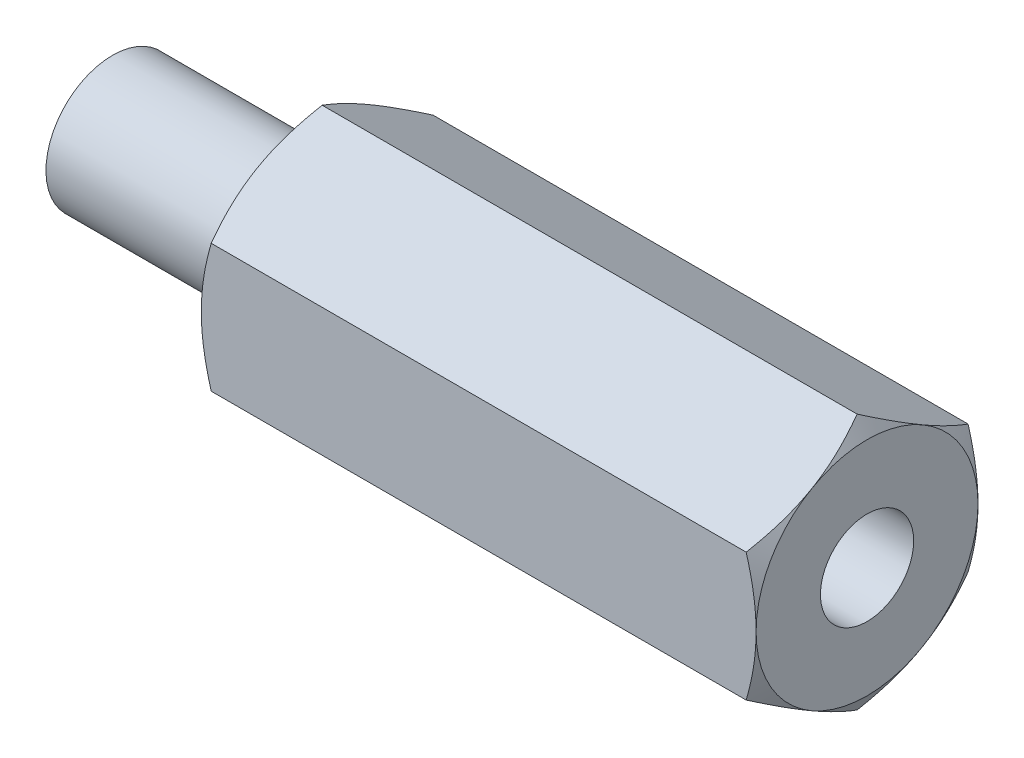
ISO-10303-21;
HEADER;
FILE_DESCRIPTION(('STEP AP214'),'2;1');
FILE_NAME('part.step','',(''),(''),'','','');
FILE_SCHEMA(('AUTOMOTIVE_DESIGN { 1 0 10303 214 1 1 1 1 }'));
ENDSEC;
DATA;
#1=APPLICATION_CONTEXT('core data for automotive mechanical design processes');
#2=APPLICATION_PROTOCOL_DEFINITION('international standard','automotive_design',2000,#1);
#3=PRODUCT_CONTEXT('',#1,'mechanical');
#4=PRODUCT('Part','Part','',(#3));
#5=PRODUCT_RELATED_PRODUCT_CATEGORY('part','',(#4));
#6=PRODUCT_DEFINITION_FORMATION('','',#4);
#7=PRODUCT_DEFINITION_CONTEXT('part definition',#1,'design');
#8=PRODUCT_DEFINITION('design','',#6,#7);
#9=PRODUCT_DEFINITION_SHAPE('','',#8);
#10=(LENGTH_UNIT() NAMED_UNIT(*) SI_UNIT(.MILLI.,.METRE.));
#11=(NAMED_UNIT(*) PLANE_ANGLE_UNIT() SI_UNIT($,.RADIAN.));
#12=(NAMED_UNIT(*) SI_UNIT($,.STERADIAN.) SOLID_ANGLE_UNIT());
#13=UNCERTAINTY_MEASURE_WITH_UNIT(LENGTH_MEASURE(1.E-05),#10,'distance_accuracy_value','');
#14=(GEOMETRIC_REPRESENTATION_CONTEXT(3) GLOBAL_UNCERTAINTY_ASSIGNED_CONTEXT((#13)) GLOBAL_UNIT_ASSIGNED_CONTEXT((#10,
#11,#12)) REPRESENTATION_CONTEXT('',''));
#15=CARTESIAN_POINT('',(0.,0.,0.));
#16=DIRECTION('',(0.,0.,1.));
#17=DIRECTION('',(1.,0.,0.));
#18=AXIS2_PLACEMENT_3D('',#15,#16,#17);
#19=CARTESIAN_POINT('',(25.,2.88675134594813,-5.));
#20=DIRECTION('',(0.,-0.866025403784439,0.5));
#21=DIRECTION('',(0.,-0.5,-0.866025403784439));
#22=AXIS2_PLACEMENT_3D('',#19,#20,#21);
#23=PLANE('',#22);
#24=CARTESIAN_POINT('',(24.5533513439482,2.88663587589429,-5.0002));
#25=CARTESIAN_POINT('',(24.6266134323624,3.01349970319368,-4.78046540547482));
#26=CARTESIAN_POINT('',(24.6932486780819,3.14144859993849,-4.55885141554042));
#27=CARTESIAN_POINT('',(24.8095610089892,3.39956193532121,-4.11178600454649));
#28=CARTESIAN_POINT('',(24.8591969500842,3.52973095989718,-3.88632664040923));
#29=CARTESIAN_POINT('',(24.9364489745813,3.78847564779797,-3.43816769477649));
#30=CARTESIAN_POINT('',(24.9645796217165,3.91701101576052,-3.21553790689581));
#31=CARTESIAN_POINT('',(24.9898050780463,4.11026620624322,-2.88081009815336));
#32=CARTESIAN_POINT('',(24.9953865402305,4.1747286887931,-2.76915780319494));
#33=CARTESIAN_POINT('',(25.0007977832485,4.30371322717527,-2.54575002932621));
#34=CARTESIAN_POINT('',(25.0006277417418,4.36823528110588,-2.43399455370969));
#35=CARTESIAN_POINT('',(24.992246368208,4.54500768479194,-2.12781576914936));
#36=CARTESIAN_POINT('',(24.9781702281028,4.65719946015292,-1.93349391403279));
#37=CARTESIAN_POINT('',(24.9335347428906,4.88083840557981,-1.5461398980023));
#38=CARTESIAN_POINT('',(24.9029601398525,4.9922847895602,-1.35310909862843));
#39=CARTESIAN_POINT('',(24.8265315063788,5.21637431361295,-0.964974657525146));
#40=CARTESIAN_POINT('',(24.7803536211213,5.32898917185759,-0.769920001358265));
#41=CARTESIAN_POINT('',(24.6755482055081,5.55253939626498,-0.382719654641231));
#42=CARTESIAN_POINT('',(24.6169452965626,5.66347762579592,-0.190569004591912));
#43=CARTESIAN_POINT('',(24.5533513439482,5.7736181619501,0.000200000000001614));
#44=B_SPLINE_CURVE_WITH_KNOTS('',3,(#24,#25,#26,#27,#28,#29,#30,#31,#32,#33,#34,#35,#36,#37,#38,
#39,#40,#41,#42,#43),.UNSPECIFIED.,.F.,.F.,(4,2,2,2,2,2,2,2,2,4),(0.,0.79255584136309,
1.58701660053333,2.3618153748728,2.74884076077325,3.13585419177294,3.80962362599679,
4.48401723901189,5.17336882348928,5.86136694793725),.UNSPECIFIED.);
#45=CARTESIAN_POINT('',(24.5534180126148,2.88675134594813,-5.));
#46=VERTEX_POINT('',#45);
#47=CARTESIAN_POINT('',(25.,4.3301270189222,-2.5));
#48=VERTEX_POINT('',#47);
#49=EDGE_CURVE('E292',#46,#48,#44,.T.);
#50=ORIENTED_EDGE('',*,*,#49,.F.);
#51=DIRECTION('',(-1.,0.,0.));
#52=VECTOR('',#51,1.);
#53=CARTESIAN_POINT('',(25.,2.88675134594813,-5.));
#54=LINE('',#53,#52);
#55=CARTESIAN_POINT('',(0.446581987385197,2.88675134594812,-5.));
#56=VERTEX_POINT('',#55);
#57=EDGE_CURVE('E244',#46,#56,#54,.T.);
#58=ORIENTED_EDGE('',*,*,#57,.T.);
#59=CARTESIAN_POINT('',(0.446648656051824,5.7736181619501,0.000200000000001349));
#60=CARTESIAN_POINT('',(0.373386567637631,5.64675433465071,-0.219534594525183));
#61=CARTESIAN_POINT('',(0.306751321918089,5.5188054379059,-0.441148584459578));
#62=CARTESIAN_POINT('',(0.190438991010809,5.26069210252318,-0.888213995453511));
#63=CARTESIAN_POINT('',(0.140803049915787,5.13052307794721,-1.11367335959077));
#64=CARTESIAN_POINT('',(0.0635510254186968,4.87177839004641,-1.56183230522351));
#65=CARTESIAN_POINT('',(0.0354203782834885,4.74324302208387,-1.78446209310419));
#66=CARTESIAN_POINT('',(0.0101949219536841,4.54998783160116,-2.11918990184664));
#67=CARTESIAN_POINT('',(0.00461345976948367,4.48552534905128,-2.23084219680506));
#68=CARTESIAN_POINT('',(-0.000797783248529871,4.35654081066911,-2.45424997067379));
#69=CARTESIAN_POINT('',(-0.000627741741796655,4.2920187567385,-2.56600544629031));
#70=CARTESIAN_POINT('',(0.00775363179203651,4.11524635305244,-2.87218423085063));
#71=CARTESIAN_POINT('',(0.0218297718972515,4.00305457769146,-3.06650608596721));
#72=CARTESIAN_POINT('',(0.0664652571094302,3.77941563226458,-3.4538601019977));
#73=CARTESIAN_POINT('',(0.0970398601475069,3.66796924828419,-3.64689090137157));
#74=CARTESIAN_POINT('',(0.173468493621162,3.44387972423144,-4.03502534247485));
#75=CARTESIAN_POINT('',(0.219646378878678,3.3312648659868,-4.23007999864173));
#76=CARTESIAN_POINT('',(0.324451794491931,3.10771464157941,-4.61728034535877));
#77=CARTESIAN_POINT('',(0.383054703437371,2.99677641204847,-4.80943099540809));
#78=CARTESIAN_POINT('',(0.446648656051824,2.88663587589429,-5.0002));
#79=B_SPLINE_CURVE_WITH_KNOTS('',3,(#59,#60,#61,#62,#63,#64,#65,#66,#67,#68,#69,#70,#71,#72,#73,
#74,#75,#76,#77,#78),.UNSPECIFIED.,.F.,.F.,(4,2,2,2,2,2,2,2,2,4),(0.,0.792555841363089,
1.58701660053333,2.3618153748728,2.74884076077325,3.13585419177294,3.80962362599679,
4.48401723901189,5.17336882348928,5.86136694793725),.UNSPECIFIED.);
#80=CARTESIAN_POINT('',(0.,4.33012701892219,-2.5));
#81=VERTEX_POINT('',#80);
#82=EDGE_CURVE('E301',#81,#56,#79,.T.);
#83=ORIENTED_EDGE('',*,*,#82,.F.);
#84=CARTESIAN_POINT('',(0.446581987385197,5.77350269189626,0.));
#85=VERTEX_POINT('',#84);
#86=EDGE_CURVE('E62',#85,#81,#79,.T.);
#87=ORIENTED_EDGE('',*,*,#86,.F.);
#88=DIRECTION('',(-1.,0.,0.));
#89=VECTOR('',#88,1.);
#90=CARTESIAN_POINT('',(25.,5.77350269189626,0.));
#91=LINE('',#90,#89);
#92=CARTESIAN_POINT('',(24.5534180126148,5.77350269189626,0.));
#93=VERTEX_POINT('',#92);
#94=EDGE_CURVE('E254',#93,#85,#91,.T.);
#95=ORIENTED_EDGE('',*,*,#94,.F.);
#96=EDGE_CURVE('E210',#48,#93,#44,.T.);
#97=ORIENTED_EDGE('',*,*,#96,.F.);
#98=EDGE_LOOP('',(#50,#58,#83,#87,#95,#97));
#99=FACE_BOUND('',#98,.T.);
#100=ADVANCED_FACE('F39',(#99),#23,.F.);
#101=CARTESIAN_POINT('',(25.,5.77350269189626,0.));
#102=DIRECTION('',(0.,-0.866025403784439,-0.5));
#103=DIRECTION('',(0.,0.5,-0.866025403784439));
#104=AXIS2_PLACEMENT_3D('',#101,#102,#103);
#105=PLANE('',#104);
#106=CARTESIAN_POINT('',(24.5533513439482,5.7736181619501,-0.000199999999998705));
#107=CARTESIAN_POINT('',(24.6266134323624,5.64675433465071,0.219534594525186));
#108=CARTESIAN_POINT('',(24.6932486780819,5.5188054379059,0.441148584459581));
#109=CARTESIAN_POINT('',(24.8095610089892,5.26069210252318,0.888213995453513));
#110=CARTESIAN_POINT('',(24.8591969500842,5.13052307794721,1.11367335959077));
#111=CARTESIAN_POINT('',(24.9364489745813,4.87177839004641,1.56183230522351));
#112=CARTESIAN_POINT('',(24.9645796217165,4.74324302208387,1.78446209310419));
#113=CARTESIAN_POINT('',(24.9898050780463,4.54998783160116,2.11918990184664));
#114=CARTESIAN_POINT('',(24.9953865402305,4.48552534905128,2.23084219680506));
#115=CARTESIAN_POINT('',(25.0007977832485,4.35654081066911,2.4542499706738));
#116=CARTESIAN_POINT('',(25.0006277417418,4.2920187567385,2.56600544629031));
#117=CARTESIAN_POINT('',(24.992246368208,4.11524635305244,2.87218423085064));
#118=CARTESIAN_POINT('',(24.9781702281027,4.00305457769146,3.06650608596721));
#119=CARTESIAN_POINT('',(24.9335347428906,3.77941563226458,3.45386010199771));
#120=CARTESIAN_POINT('',(24.9029601398525,3.66796924828419,3.64689090137157));
#121=CARTESIAN_POINT('',(24.8265315063788,3.44387972423144,4.03502534247485));
#122=CARTESIAN_POINT('',(24.7803536211213,3.3312648659868,4.23007999864174));
#123=CARTESIAN_POINT('',(24.6755482055081,3.10771464157941,4.61728034535877));
#124=CARTESIAN_POINT('',(24.6169452965626,2.99677641204847,4.80943099540809));
#125=CARTESIAN_POINT('',(24.5533513439482,2.88663587589429,5.0002));
#126=B_SPLINE_CURVE_WITH_KNOTS('',3,(#106,#107,#108,#109,#110,#111,#112,#113,#114,#115,#116,
#117,#118,#119,#120,#121,#122,#123,#124,#125),.UNSPECIFIED.,.F.,.F.,(4,2,2,2,2,2,2,2,2,4),(0.,
0.792555841363089,1.58701660053333,2.3618153748728,2.74884076077325,3.13585419177295,
3.80962362599679,4.48401723901189,5.17336882348928,5.86136694793725),.UNSPECIFIED.);
#127=CARTESIAN_POINT('',(25.,4.3301270189222,2.5));
#128=VERTEX_POINT('',#127);
#129=EDGE_CURVE('E208',#93,#128,#126,.T.);
#130=ORIENTED_EDGE('',*,*,#129,.F.);
#131=ORIENTED_EDGE('',*,*,#94,.T.);
#132=CARTESIAN_POINT('',(0.446648656051825,2.88663587589429,5.0002));
#133=CARTESIAN_POINT('',(0.373386567637632,3.01349970319368,4.78046540547482));
#134=CARTESIAN_POINT('',(0.30675132191809,3.14144859993849,4.55885141554042));
#135=CARTESIAN_POINT('',(0.19043899101081,3.39956193532121,4.11178600454649));
#136=CARTESIAN_POINT('',(0.140803049915788,3.52973095989718,3.88632664040923));
#137=CARTESIAN_POINT('',(0.0635510254186981,3.78847564779798,3.43816769477649));
#138=CARTESIAN_POINT('',(0.0354203782834897,3.91701101576052,3.21553790689581));
#139=CARTESIAN_POINT('',(0.0101949219536848,4.11026620624322,2.88081009815336));
#140=CARTESIAN_POINT('',(0.00461345976948421,4.17472868879311,2.76915780319494));
#141=CARTESIAN_POINT('',(-0.000797783248529407,4.30371322717528,2.5457500293262));
#142=CARTESIAN_POINT('',(-0.000627741741796067,4.36823528110589,2.43399455370969));
#143=CARTESIAN_POINT('',(0.00775363179203718,4.54500768479194,2.12781576914936));
#144=CARTESIAN_POINT('',(0.0218297718972518,4.65719946015292,1.93349391403279));
#145=CARTESIAN_POINT('',(0.0664652571094305,4.88083840557981,1.5461398980023));
#146=CARTESIAN_POINT('',(0.0970398601475074,4.9922847895602,1.35310909862843));
#147=CARTESIAN_POINT('',(0.173468493621162,5.21637431361295,0.964974657525148));
#148=CARTESIAN_POINT('',(0.219646378878678,5.32898917185759,0.769920001358267));
#149=CARTESIAN_POINT('',(0.324451794491931,5.55253939626498,0.382719654641233));
#150=CARTESIAN_POINT('',(0.38305470343737,5.66347762579592,0.190569004591914));
#151=CARTESIAN_POINT('',(0.446648656051824,5.7736181619501,-0.000199999999999497));
#152=B_SPLINE_CURVE_WITH_KNOTS('',3,(#132,#133,#134,#135,#136,#137,#138,#139,#140,#141,#142,
#143,#144,#145,#146,#147,#148,#149,#150,#151),.UNSPECIFIED.,.F.,.F.,(4,2,2,2,2,2,2,2,2,4),(0.,
0.79255584136309,1.58701660053333,2.3618153748728,2.74884076077325,3.13585419177295,
3.80962362599679,4.48401723901189,5.17336882348928,5.86136694793725),.UNSPECIFIED.);
#153=CARTESIAN_POINT('',(0.,4.33012701892219,2.5));
#154=VERTEX_POINT('',#153);
#155=EDGE_CURVE('E224',#154,#85,#152,.T.);
#156=ORIENTED_EDGE('',*,*,#155,.F.);
#157=CARTESIAN_POINT('',(0.446581987385197,2.88675134594812,5.));
#158=VERTEX_POINT('',#157);
#159=EDGE_CURVE('E230',#158,#154,#152,.T.);
#160=ORIENTED_EDGE('',*,*,#159,.F.);
#161=DIRECTION('',(-1.,0.,0.));
#162=VECTOR('',#161,1.);
#163=CARTESIAN_POINT('',(25.,2.88675134594813,5.));
#164=LINE('',#163,#162);
#165=CARTESIAN_POINT('',(24.5534180126148,2.88675134594813,5.));
#166=VERTEX_POINT('',#165);
#167=EDGE_CURVE('E252',#166,#158,#164,.T.);
#168=ORIENTED_EDGE('',*,*,#167,.F.);
#169=EDGE_CURVE('E203',#128,#166,#126,.T.);
#170=ORIENTED_EDGE('',*,*,#169,.F.);
#171=EDGE_LOOP('',(#130,#131,#156,#160,#168,#170));
#172=FACE_BOUND('',#171,.T.);
#173=ADVANCED_FACE('F215',(#172),#105,.F.);
#174=CARTESIAN_POINT('',(25.,2.88675134594813,5.));
#175=DIRECTION('',(0.,0.,-1.));
#176=DIRECTION('',(0.,1.,0.));
#177=AXIS2_PLACEMENT_3D('',#174,#175,#176);
#178=PLANE('',#177);
#179=CARTESIAN_POINT('',(22.6073664734492,-7.65608998744865,5.));
#180=CARTESIAN_POINT('',(22.713454661828,-7.43656171400166,5.));
#181=CARTESIAN_POINT('',(22.8184882453841,-7.21651440170021,5.));
#182=CARTESIAN_POINT('',(23.0258435663603,-6.77510105921518,5.));
#183=CARTESIAN_POINT('',(23.1281648342544,-6.55373480873052,5.));
#184=CARTESIAN_POINT('',(23.3300319214651,-6.10820714710356,5.));
#185=CARTESIAN_POINT('',(23.4295585071827,-5.88403698971124,5.));
#186=CARTESIAN_POINT('',(23.6243367672132,-5.43385418074676,5.));
#187=CARTESIAN_POINT('',(23.7195886643576,-5.20784162594277,5.));
#188=CARTESIAN_POINT('',(23.9058116908106,-4.75080884782755,5.));
#189=CARTESIAN_POINT('',(23.9967159090013,-4.51976121099504,5.));
#190=CARTESIAN_POINT('',(24.1714046970281,-4.05494053422099,5.));
#191=CARTESIAN_POINT('',(24.2551884747524,-3.82116719434024,5.));
#192=CARTESIAN_POINT('',(24.4133853676354,-3.35100416711889,5.));
#193=CARTESIAN_POINT('',(24.4878184047747,-3.11462125088187,5.));
#194=CARTESIAN_POINT('',(24.6248956061276,-2.63849247870023,5.));
#195=CARTESIAN_POINT('',(24.6875434984031,-2.3987477121033,5.));
#196=CARTESIAN_POINT('',(24.7980122460051,-1.91574303714497,5.));
#197=CARTESIAN_POINT('',(24.8458291534414,-1.672482210841,5.));
#198=CARTESIAN_POINT('',(24.9234044442076,-1.18299359688664,5.));
#199=CARTESIAN_POINT('',(24.9531628115716,-0.936765806613281,5.));
#200=CARTESIAN_POINT('',(24.9823487984137,-0.567032279323849,5.));
#201=CARTESIAN_POINT('',(24.9895036809401,-0.444105297658541,5.));
#202=CARTESIAN_POINT('',(24.998604547731,-0.198053005238567,5.));
#203=CARTESIAN_POINT('',(25.0005505996396,-0.0749276970802314,5.));
#204=CARTESIAN_POINT('',(24.9991815296543,0.17125799989235,5.));
#205=CARTESIAN_POINT('',(24.995867885687,0.294318397227084,5.));
#206=CARTESIAN_POINT('',(24.9840634027172,0.540192730788837,5.));
#207=CARTESIAN_POINT('',(24.9755723024298,0.66300665426348,5.));
#208=CARTESIAN_POINT('',(24.9488936197247,0.960681872881667,5.));
#209=CARTESIAN_POINT('',(24.9281110323017,1.1353143627994,5.));
#210=CARTESIAN_POINT('',(24.8772343442773,1.4832167579939,5.));
#211=CARTESIAN_POINT('',(24.84713900201,1.65648647841238,5.));
#212=CARTESIAN_POINT('',(24.7787012079885,2.00155426058701,5.));
#213=CARTESIAN_POINT('',(24.7403505225136,2.17335067370376,5.));
#214=CARTESIAN_POINT('',(24.656571694615,2.51518168221057,5.));
#215=CARTESIAN_POINT('',(24.611143983086,2.68521638419314,5.));
#216=CARTESIAN_POINT('',(24.5131122179457,3.02770318928896,5.));
#217=CARTESIAN_POINT('',(24.4603596361761,3.20011248435316,5.));
#218=CARTESIAN_POINT('',(24.3496422126974,3.54310870430182,5.));
#219=CARTESIAN_POINT('',(24.2916809660929,3.7136967965972,5.));
#220=CARTESIAN_POINT('',(24.1717434592715,4.0523661026798,5.));
#221=CARTESIAN_POINT('',(24.1097916345736,4.22045602230063,5.));
#222=CARTESIAN_POINT('',(23.9822517658619,4.55533171687456,5.));
#223=CARTESIAN_POINT('',(23.9166622522122,4.72211693321423,5.));
#224=CARTESIAN_POINT('',(23.8496137418227,4.88829623733364,5.));
#225=B_SPLINE_CURVE_WITH_KNOTS('',3,(#179,#180,#181,#182,#183,#184,#185,#186,#187,#188,#189,
#190,#191,#192,#193,#194,#195,#196,#197,#198,#199,#200,#201,#202,#203,#204,#205,#206,#207,#208,
#209,#210,#211,#212,#213,#214,#215,#216,#217,#218,#219,#220,#221,#222,#223,#224),.UNSPECIFIED.,
.F.,.F.,(4,2,2,2,2,2,2,2,2,2,2,2,2,2,2,2,2,2,2,2,2,2,4),(0.,0.731464740665349,1.46305528824908,
2.19883243307486,2.93457117856033,3.67934251246857,4.4241965901336,5.16743580871988,
5.91043951739337,6.65364083834805,7.39684281638514,7.76615414335454,8.13546067426608,
8.50466345177854,8.8738848629845,9.40118542949726,9.92855633110015,10.4564556797854,
10.9843228991235,11.525120280828,12.0655472210641,12.6029322754131,13.1405360390026),.UNSPECIFIED.);
#226=CARTESIAN_POINT('',(25.,0.,5.));
#227=VERTEX_POINT('',#226);
#228=EDGE_CURVE('E209',#166,#227,#225,.F.);
#229=ORIENTED_EDGE('',*,*,#228,.F.);
#230=ORIENTED_EDGE('',*,*,#167,.T.);
#231=CARTESIAN_POINT('',(2.39263352655076,-7.65608998744865,5.));
#232=CARTESIAN_POINT('',(2.28654533817203,-7.43656171400166,5.));
#233=CARTESIAN_POINT('',(2.18151175461592,-7.21651440170021,5.));
#234=CARTESIAN_POINT('',(1.97415643363973,-6.77510105921518,5.));
#235=CARTESIAN_POINT('',(1.87183516574565,-6.55373480873052,5.));
#236=CARTESIAN_POINT('',(1.66996807853488,-6.10820714710356,5.));
#237=CARTESIAN_POINT('',(1.57044149281728,-5.88403698971124,5.));
#238=CARTESIAN_POINT('',(1.37566323278679,-5.43385418074676,5.));
#239=CARTESIAN_POINT('',(1.28041133564241,-5.20784162594277,5.));
#240=CARTESIAN_POINT('',(1.09418830918939,-4.75080884782755,5.));
#241=CARTESIAN_POINT('',(1.00328409099868,-4.51976121099505,5.));
#242=CARTESIAN_POINT('',(0.828595302971934,-4.05494053422099,5.));
#243=CARTESIAN_POINT('',(0.744811525247638,-3.82116719434024,5.));
#244=CARTESIAN_POINT('',(0.586614632364609,-3.35100416711889,5.));
#245=CARTESIAN_POINT('',(0.512181595225262,-3.11462125088187,5.));
#246=CARTESIAN_POINT('',(0.375104393872371,-2.63849247870023,5.));
#247=CARTESIAN_POINT('',(0.312456501596944,-2.3987477121033,5.));
#248=CARTESIAN_POINT('',(0.201987753994866,-1.91574303714497,5.));
#249=CARTESIAN_POINT('',(0.15417084655864,-1.672482210841,5.));
#250=CARTESIAN_POINT('',(0.0765955557924016,-1.18299359688664,5.));
#251=CARTESIAN_POINT('',(0.0468371884284089,-0.936765806613282,5.));
#252=CARTESIAN_POINT('',(0.0176512015862967,-0.567032279323849,5.));
#253=CARTESIAN_POINT('',(0.0104963190599473,-0.444105297658542,5.));
#254=CARTESIAN_POINT('',(0.00139545226904139,-0.198053005238568,5.));
#255=CARTESIAN_POINT('',(-0.000550599639613759,-0.0749276970802312,5.));
#256=CARTESIAN_POINT('',(0.000818470345664651,0.171257999892351,5.));
#257=CARTESIAN_POINT('',(0.00413211431301193,0.294318397227086,5.));
#258=CARTESIAN_POINT('',(0.01593659728276,0.540192730788838,5.));
#259=CARTESIAN_POINT('',(0.024427697570165,0.663006654263481,5.));
#260=CARTESIAN_POINT('',(0.0511063802753007,0.960681872881667,5.));
#261=CARTESIAN_POINT('',(0.0718889676982861,1.1353143627994,5.));
#262=CARTESIAN_POINT('',(0.122765655722695,1.4832167579939,5.));
#263=CARTESIAN_POINT('',(0.152860997990035,1.65648647841238,5.));
#264=CARTESIAN_POINT('',(0.221298792011553,2.00155426058701,5.));
#265=CARTESIAN_POINT('',(0.259649477486407,2.17335067370376,5.));
#266=CARTESIAN_POINT('',(0.343428305385015,2.51518168221057,5.));
#267=CARTESIAN_POINT('',(0.388856016914006,2.68521638419314,5.));
#268=CARTESIAN_POINT('',(0.486887782054298,3.02770318928896,5.));
#269=CARTESIAN_POINT('',(0.539640363823949,3.20011248435316,5.));
#270=CARTESIAN_POINT('',(0.650357787302634,3.54310870430182,5.));
#271=CARTESIAN_POINT('',(0.708319033907079,3.7136967965972,5.));
#272=CARTESIAN_POINT('',(0.828256540728484,4.0523661026798,5.));
#273=CARTESIAN_POINT('',(0.890208365426376,4.22045602230063,5.));
#274=CARTESIAN_POINT('',(1.01774823413813,4.55533171687456,5.));
#275=CARTESIAN_POINT('',(1.08333774778779,4.72211693321422,5.));
#276=CARTESIAN_POINT('',(1.15038625817726,4.88829623733364,5.));
#277=B_SPLINE_CURVE_WITH_KNOTS('',3,(#231,#232,#233,#234,#235,#236,#237,#238,#239,#240,#241,
#242,#243,#244,#245,#246,#247,#248,#249,#250,#251,#252,#253,#254,#255,#256,#257,#258,#259,#260,
#261,#262,#263,#264,#265,#266,#267,#268,#269,#270,#271,#272,#273,#274,#275,#276),.UNSPECIFIED.,
.F.,.F.,(4,2,2,2,2,2,2,2,2,2,2,2,2,2,2,2,2,2,2,2,2,2,4),(0.,0.731464740665351,1.46305528824908,
2.19883243307485,2.93457117856033,3.67934251246857,4.4241965901336,5.16743580871988,
5.91043951739337,6.65364083834805,7.39684281638514,7.76615414335454,8.13546067426608,
8.50466345177854,8.87388486298451,9.40118542949726,9.92855633110015,10.4564556797854,
10.9843228991235,11.525120280828,12.0655472210641,12.6029322754131,13.1405360390026),.UNSPECIFIED.);
#278=CARTESIAN_POINT('',(0.,0.,5.));
#279=VERTEX_POINT('',#278);
#280=EDGE_CURVE('E236',#279,#158,#277,.T.);
#281=ORIENTED_EDGE('',*,*,#280,.F.);
#282=CARTESIAN_POINT('',(0.446581987385197,-2.88675134594813,5.));
#283=VERTEX_POINT('',#282);
#284=EDGE_CURVE('E242',#283,#279,#277,.T.);
#285=ORIENTED_EDGE('',*,*,#284,.F.);
#286=DIRECTION('',(-1.,0.,0.));
#287=VECTOR('',#286,1.);
#288=CARTESIAN_POINT('',(25.,-2.88675134594813,5.));
#289=LINE('',#288,#287);
#290=CARTESIAN_POINT('',(24.5534180126148,-2.88675134594813,5.));
#291=VERTEX_POINT('',#290);
#292=EDGE_CURVE('E250',#291,#283,#289,.T.);
#293=ORIENTED_EDGE('',*,*,#292,.F.);
#294=EDGE_CURVE('E197',#227,#291,#225,.F.);
#295=ORIENTED_EDGE('',*,*,#294,.F.);
#296=EDGE_LOOP('',(#229,#230,#281,#285,#293,#295));
#297=FACE_BOUND('',#296,.T.);
#298=ADVANCED_FACE('F218',(#297),#178,.F.);
#299=CARTESIAN_POINT('',(25.,-2.88675134594813,5.));
#300=DIRECTION('',(0.,0.866025403784439,-0.5));
#301=DIRECTION('',(0.,0.5,0.866025403784439));
#302=AXIS2_PLACEMENT_3D('',#299,#300,#301);
#303=PLANE('',#302);
#304=CARTESIAN_POINT('',(24.5533513439482,-2.88663587589429,5.0002));
#305=CARTESIAN_POINT('',(24.6266134323624,-3.01349970319368,4.78046540547481));
#306=CARTESIAN_POINT('',(24.6932486780819,-3.14144859993849,4.55885141554042));
#307=CARTESIAN_POINT('',(24.8095610089892,-3.39956193532121,4.11178600454649));
#308=CARTESIAN_POINT('',(24.8591969500842,-3.52973095989718,3.88632664040923));
#309=CARTESIAN_POINT('',(24.9364489745813,-3.78847564779798,3.43816769477649));
#310=CARTESIAN_POINT('',(24.9645796217165,-3.91701101576052,3.21553790689581));
#311=CARTESIAN_POINT('',(24.9898050780463,-4.11026620624323,2.88081009815336));
#312=CARTESIAN_POINT('',(24.9953865402305,-4.17472868879311,2.76915780319494));
#313=CARTESIAN_POINT('',(25.0007977832485,-4.30371322717528,2.5457500293262));
#314=CARTESIAN_POINT('',(25.0006277417418,-4.36823528110589,2.43399455370969));
#315=CARTESIAN_POINT('',(24.992246368208,-4.54500768479194,2.12781576914936));
#316=CARTESIAN_POINT('',(24.9781702281028,-4.65719946015292,1.93349391403279));
#317=CARTESIAN_POINT('',(24.9335347428906,-4.88083840557981,1.5461398980023));
#318=CARTESIAN_POINT('',(24.9029601398525,-4.9922847895602,1.35310909862843));
#319=CARTESIAN_POINT('',(24.8265315063788,-5.21637431361295,0.964974657525147));
#320=CARTESIAN_POINT('',(24.7803536211213,-5.32898917185759,0.769920001358266));
#321=CARTESIAN_POINT('',(24.6755482055081,-5.55253939626498,0.382719654641234));
#322=CARTESIAN_POINT('',(24.6169452965626,-5.66347762579592,0.190569004591916));
#323=CARTESIAN_POINT('',(24.5533513439482,-5.7736181619501,-0.000199999999998652));
#324=B_SPLINE_CURVE_WITH_KNOTS('',3,(#304,#305,#306,#307,#308,#309,#310,#311,#312,#313,#314,
#315,#316,#317,#318,#319,#320,#321,#322,#323),.UNSPECIFIED.,.F.,.F.,(4,2,2,2,2,2,2,2,2,4),(0.,
0.792555841363089,1.58701660053333,2.3618153748728,2.74884076077325,3.13585419177295,
3.80962362599679,4.48401723901189,5.17336882348928,5.86136694793725),.UNSPECIFIED.);
#325=CARTESIAN_POINT('',(25.,-4.3301270189222,2.5));
#326=VERTEX_POINT('',#325);
#327=EDGE_CURVE('E554',#291,#326,#324,.T.);
#328=ORIENTED_EDGE('',*,*,#327,.F.);
#329=ORIENTED_EDGE('',*,*,#292,.T.);
#330=CARTESIAN_POINT('',(0.446648656051824,-5.7736181619501,-0.000199999999999135));
#331=CARTESIAN_POINT('',(0.373386567637632,-5.64675433465071,0.219534594525186));
#332=CARTESIAN_POINT('',(0.30675132191809,-5.5188054379059,0.441148584459581));
#333=CARTESIAN_POINT('',(0.190438991010809,-5.26069210252318,0.888213995453514));
#334=CARTESIAN_POINT('',(0.140803049915788,-5.13052307794721,1.11367335959077));
#335=CARTESIAN_POINT('',(0.0635510254186977,-4.87177839004641,1.56183230522351));
#336=CARTESIAN_POINT('',(0.0354203782834896,-4.74324302208387,1.78446209310419));
#337=CARTESIAN_POINT('',(0.0101949219536848,-4.54998783160116,2.11918990184664));
#338=CARTESIAN_POINT('',(0.00461345976948422,-4.48552534905128,2.23084219680506));
#339=CARTESIAN_POINT('',(-0.000797783248529419,-4.35654081066911,2.4542499706738));
#340=CARTESIAN_POINT('',(-0.000627741741796081,-4.2920187567385,2.56600544629031));
#341=CARTESIAN_POINT('',(0.00775363179203722,-4.11524635305244,2.87218423085064));
#342=CARTESIAN_POINT('',(0.021829771897252,-4.00305457769146,3.06650608596721));
#343=CARTESIAN_POINT('',(0.0664652571094308,-3.77941563226458,3.4538601019977));
#344=CARTESIAN_POINT('',(0.0970398601475078,-3.66796924828419,3.64689090137157));
#345=CARTESIAN_POINT('',(0.173468493621163,-3.44387972423144,4.03502534247485));
#346=CARTESIAN_POINT('',(0.219646378878679,-3.3312648659868,4.23007999864174));
#347=CARTESIAN_POINT('',(0.324451794491932,-3.10771464157941,4.61728034535877));
#348=CARTESIAN_POINT('',(0.383054703437371,-2.99677641204847,4.80943099540809));
#349=CARTESIAN_POINT('',(0.446648656051825,-2.88663587589429,5.0002));
#350=B_SPLINE_CURVE_WITH_KNOTS('',3,(#330,#331,#332,#333,#334,#335,#336,#337,#338,#339,#340,
#341,#342,#343,#344,#345,#346,#347,#348,#349),.UNSPECIFIED.,.F.,.F.,(4,2,2,2,2,2,2,2,2,4),(0.,
0.792555841363089,1.58701660053333,2.3618153748728,2.74884076077325,3.13585419177295,
3.80962362599679,4.48401723901189,5.17336882348928,5.86136694793725),.UNSPECIFIED.);
#351=CARTESIAN_POINT('',(0.,-4.33012701892219,2.5));
#352=VERTEX_POINT('',#351);
#353=EDGE_CURVE('E243',#352,#283,#350,.T.);
#354=ORIENTED_EDGE('',*,*,#353,.F.);
#355=CARTESIAN_POINT('',(0.446581987385197,-5.77350269189626,0.));
#356=VERTEX_POINT('',#355);
#357=EDGE_CURVE('E231',#356,#352,#350,.T.);
#358=ORIENTED_EDGE('',*,*,#357,.F.);
#359=DIRECTION('',(-1.,0.,0.));
#360=VECTOR('',#359,1.);
#361=CARTESIAN_POINT('',(25.,-5.77350269189626,0.));
#362=LINE('',#361,#360);
#363=CARTESIAN_POINT('',(24.5534180126148,-5.77350269189626,0.));
#364=VERTEX_POINT('',#363);
#365=EDGE_CURVE('E248',#364,#356,#362,.T.);
#366=ORIENTED_EDGE('',*,*,#365,.F.);
#367=EDGE_CURVE('E191',#326,#364,#324,.T.);
#368=ORIENTED_EDGE('',*,*,#367,.F.);
#369=EDGE_LOOP('',(#328,#329,#354,#358,#366,#368));
#370=FACE_BOUND('',#369,.T.);
#371=ADVANCED_FACE('F322',(#370),#303,.F.);
#372=CARTESIAN_POINT('',(25.,-5.77350269189626,0.));
#373=DIRECTION('',(0.,0.866025403784439,0.5));
#374=DIRECTION('',(0.,-0.5,0.866025403784439));
#375=AXIS2_PLACEMENT_3D('',#372,#373,#374);
#376=PLANE('',#375);
#377=CARTESIAN_POINT('',(24.5533513439482,-5.7736181619501,0.000200000000000865));
#378=CARTESIAN_POINT('',(24.6266134323624,-5.64675433465071,-0.219534594525184));
#379=CARTESIAN_POINT('',(24.6932486780819,-5.5188054379059,-0.441148584459579));
#380=CARTESIAN_POINT('',(24.8095610089892,-5.26069210252318,-0.888213995453511));
#381=CARTESIAN_POINT('',(24.8591969500842,-5.13052307794721,-1.11367335959077));
#382=CARTESIAN_POINT('',(24.9364489745813,-4.87177839004641,-1.56183230522351));
#383=CARTESIAN_POINT('',(24.9645796217165,-4.74324302208387,-1.78446209310419));
#384=CARTESIAN_POINT('',(24.9898050780463,-4.54998783160116,-2.11918990184664));
#385=CARTESIAN_POINT('',(24.9953865402305,-4.48552534905128,-2.23084219680506));
#386=CARTESIAN_POINT('',(25.0007977832485,-4.35654081066911,-2.45424997067379));
#387=CARTESIAN_POINT('',(25.0006277417418,-4.2920187567385,-2.56600544629031));
#388=CARTESIAN_POINT('',(24.992246368208,-4.11524635305245,-2.87218423085064));
#389=CARTESIAN_POINT('',(24.9781702281028,-4.00305457769146,-3.06650608596721));
#390=CARTESIAN_POINT('',(24.9335347428906,-3.77941563226458,-3.4538601019977));
#391=CARTESIAN_POINT('',(24.9029601398525,-3.66796924828419,-3.64689090137157));
#392=CARTESIAN_POINT('',(24.8265315063788,-3.44387972423144,-4.03502534247485));
#393=CARTESIAN_POINT('',(24.7803536211213,-3.3312648659868,-4.23007999864173));
#394=CARTESIAN_POINT('',(24.6755482055081,-3.10771464157941,-4.61728034535877));
#395=CARTESIAN_POINT('',(24.6169452965626,-2.99677641204847,-4.80943099540809));
#396=CARTESIAN_POINT('',(24.5533513439482,-2.88663587589429,-5.0002));
#397=B_SPLINE_CURVE_WITH_KNOTS('',3,(#377,#378,#379,#380,#381,#382,#383,#384,#385,#386,#387,
#388,#389,#390,#391,#392,#393,#394,#395,#396),.UNSPECIFIED.,.F.,.F.,(4,2,2,2,2,2,2,2,2,4),(0.,
0.792555841363089,1.58701660053333,2.3618153748728,2.74884076077325,3.13585419177295,
3.80962362599679,4.48401723901189,5.17336882348928,5.86136694793725),.UNSPECIFIED.);
#398=CARTESIAN_POINT('',(25.,-4.3301270189222,-2.5));
#399=VERTEX_POINT('',#398);
#400=EDGE_CURVE('E284',#364,#399,#397,.T.);
#401=ORIENTED_EDGE('',*,*,#400,.F.);
#402=ORIENTED_EDGE('',*,*,#365,.T.);
#403=CARTESIAN_POINT('',(0.446648656051825,-2.88663587589429,-5.0002));
#404=CARTESIAN_POINT('',(0.373386567637631,-3.01349970319368,-4.78046540547482));
#405=CARTESIAN_POINT('',(0.306751321918089,-3.14144859993849,-4.55885141554042));
#406=CARTESIAN_POINT('',(0.190438991010809,-3.39956193532121,-4.11178600454649));
#407=CARTESIAN_POINT('',(0.140803049915788,-3.52973095989718,-3.88632664040923));
#408=CARTESIAN_POINT('',(0.0635510254186982,-3.78847564779798,-3.43816769477649));
#409=CARTESIAN_POINT('',(0.0354203782834899,-3.91701101576052,-3.21553790689581));
#410=CARTESIAN_POINT('',(0.0101949219536849,-4.11026620624322,-2.88081009815336));
#411=CARTESIAN_POINT('',(0.00461345976948429,-4.17472868879311,-2.76915780319494));
#412=CARTESIAN_POINT('',(-0.000797783248529509,-4.30371322717528,-2.5457500293262));
#413=CARTESIAN_POINT('',(-0.000627741741796267,-4.36823528110589,-2.43399455370969));
#414=CARTESIAN_POINT('',(0.00775363179203684,-4.54500768479194,-2.12781576914936));
#415=CARTESIAN_POINT('',(0.0218297718972515,-4.65719946015292,-1.93349391403279));
#416=CARTESIAN_POINT('',(0.0664652571094302,-4.88083840557981,-1.54613989800229));
#417=CARTESIAN_POINT('',(0.0970398601475072,-4.9922847895602,-1.35310909862843));
#418=CARTESIAN_POINT('',(0.173468493621162,-5.21637431361295,-0.964974657525145));
#419=CARTESIAN_POINT('',(0.219646378878678,-5.32898917185759,-0.769920001358264));
#420=CARTESIAN_POINT('',(0.324451794491932,-5.55253939626498,-0.382719654641231));
#421=CARTESIAN_POINT('',(0.383054703437371,-5.66347762579592,-0.190569004591912));
#422=CARTESIAN_POINT('',(0.446648656051825,-5.7736181619501,0.000200000000001058));
#423=B_SPLINE_CURVE_WITH_KNOTS('',3,(#403,#404,#405,#406,#407,#408,#409,#410,#411,#412,#413,
#414,#415,#416,#417,#418,#419,#420,#421,#422),.UNSPECIFIED.,.F.,.F.,(4,2,2,2,2,2,2,2,2,4),(0.,
0.79255584136309,1.58701660053333,2.3618153748728,2.74884076077325,3.13585419177295,
3.80962362599679,4.48401723901189,5.17336882348929,5.86136694793725),.UNSPECIFIED.);
#424=CARTESIAN_POINT('',(0.,-4.33012701892219,-2.5));
#425=VERTEX_POINT('',#424);
#426=EDGE_CURVE('E306',#425,#356,#423,.T.);
#427=ORIENTED_EDGE('',*,*,#426,.F.);
#428=CARTESIAN_POINT('',(0.446581987385197,-2.88675134594812,-5.));
#429=VERTEX_POINT('',#428);
#430=EDGE_CURVE('E305',#429,#425,#423,.T.);
#431=ORIENTED_EDGE('',*,*,#430,.F.);
#432=DIRECTION('',(-1.,0.,0.));
#433=VECTOR('',#432,1.);
#434=CARTESIAN_POINT('',(25.,-2.88675134594813,-5.));
#435=LINE('',#434,#433);
#436=CARTESIAN_POINT('',(24.5534180126148,-2.88675134594813,-5.));
#437=VERTEX_POINT('',#436);
#438=EDGE_CURVE('E246',#437,#429,#435,.T.);
#439=ORIENTED_EDGE('',*,*,#438,.F.);
#440=EDGE_CURVE('E162',#399,#437,#397,.T.);
#441=ORIENTED_EDGE('',*,*,#440,.F.);
#442=EDGE_LOOP('',(#401,#402,#427,#431,#439,#441));
#443=FACE_BOUND('',#442,.T.);
#444=ADVANCED_FACE('F283',(#443),#376,.F.);
#445=CARTESIAN_POINT('',(25.,-2.88675134594813,-5.));
#446=DIRECTION('',(0.,0.,1.));
#447=DIRECTION('',(1.,0.,0.));
#448=AXIS2_PLACEMENT_3D('',#445,#446,#447);
#449=PLANE('',#448);
#450=CARTESIAN_POINT('',(22.6073664734492,-7.65608998744865,-5.));
#451=CARTESIAN_POINT('',(22.713454661828,-7.43656171400166,-5.));
#452=CARTESIAN_POINT('',(22.8184882453841,-7.21651440170021,-5.));
#453=CARTESIAN_POINT('',(23.0258435663603,-6.77510105921518,-5.));
#454=CARTESIAN_POINT('',(23.1281648342544,-6.55373480873052,-5.));
#455=CARTESIAN_POINT('',(23.3300319214651,-6.10820714710356,-5.));
#456=CARTESIAN_POINT('',(23.4295585071827,-5.88403698971124,-5.));
#457=CARTESIAN_POINT('',(23.6243367672132,-5.43385418074677,-5.));
#458=CARTESIAN_POINT('',(23.7195886643576,-5.20784162594278,-5.));
#459=CARTESIAN_POINT('',(23.9058116908106,-4.75080884782755,-5.));
#460=CARTESIAN_POINT('',(23.9967159090013,-4.51976121099505,-5.));
#461=CARTESIAN_POINT('',(24.1714046970281,-4.05494053422099,-5.));
#462=CARTESIAN_POINT('',(24.2551884747524,-3.82116719434024,-5.));
#463=CARTESIAN_POINT('',(24.4133853676354,-3.35100416711889,-5.));
#464=CARTESIAN_POINT('',(24.4878184047747,-3.11462125088187,-5.));
#465=CARTESIAN_POINT('',(24.6248956061276,-2.63849247870023,-5.));
#466=CARTESIAN_POINT('',(24.6875434984031,-2.3987477121033,-5.));
#467=CARTESIAN_POINT('',(24.7980122460051,-1.91574303714497,-5.));
#468=CARTESIAN_POINT('',(24.8458291534414,-1.672482210841,-5.));
#469=CARTESIAN_POINT('',(24.9234044442076,-1.18299359688664,-5.));
#470=CARTESIAN_POINT('',(24.9531628115716,-0.93676580661328,-5.));
#471=CARTESIAN_POINT('',(24.9823487984137,-0.567032279323846,-5.));
#472=CARTESIAN_POINT('',(24.9895036809401,-0.444105297658539,-5.));
#473=CARTESIAN_POINT('',(24.998604547731,-0.198053005238564,-5.));
#474=CARTESIAN_POINT('',(25.0005505996396,-0.074927697080228,-5.));
#475=CARTESIAN_POINT('',(24.9991815296543,0.171257999892353,-5.));
#476=CARTESIAN_POINT('',(24.995867885687,0.294318397227087,-5.));
#477=CARTESIAN_POINT('',(24.9840634027172,0.540192730788839,-5.));
#478=CARTESIAN_POINT('',(24.9755723024298,0.663006654263482,-5.));
#479=CARTESIAN_POINT('',(24.9488936197247,0.960681872881668,-5.));
#480=CARTESIAN_POINT('',(24.9281110323017,1.1353143627994,-5.));
#481=CARTESIAN_POINT('',(24.8772343442773,1.4832167579939,-5.));
#482=CARTESIAN_POINT('',(24.84713900201,1.65648647841238,-5.));
#483=CARTESIAN_POINT('',(24.7787012079885,2.00155426058701,-5.));
#484=CARTESIAN_POINT('',(24.7403505225136,2.17335067370376,-5.));
#485=CARTESIAN_POINT('',(24.656571694615,2.51518168221057,-5.));
#486=CARTESIAN_POINT('',(24.611143983086,2.68521638419314,-5.));
#487=CARTESIAN_POINT('',(24.5131122179457,3.02770318928896,-5.));
#488=CARTESIAN_POINT('',(24.4603596361761,3.20011248435317,-5.));
#489=CARTESIAN_POINT('',(24.3496422126974,3.54310870430182,-5.));
#490=CARTESIAN_POINT('',(24.2916809660929,3.7136967965972,-5.));
#491=CARTESIAN_POINT('',(24.1717434592715,4.0523661026798,-5.));
#492=CARTESIAN_POINT('',(24.1097916345736,4.22045602230063,-5.));
#493=CARTESIAN_POINT('',(23.9822517658619,4.55533171687456,-5.));
#494=CARTESIAN_POINT('',(23.9166622522122,4.72211693321423,-5.));
#495=CARTESIAN_POINT('',(23.8496137418227,4.88829623733364,-5.));
#496=B_SPLINE_CURVE_WITH_KNOTS('',3,(#450,#451,#452,#453,#454,#455,#456,#457,#458,#459,#460,
#461,#462,#463,#464,#465,#466,#467,#468,#469,#470,#471,#472,#473,#474,#475,#476,#477,#478,#479,
#480,#481,#482,#483,#484,#485,#486,#487,#488,#489,#490,#491,#492,#493,#494,#495),.UNSPECIFIED.,
.F.,.F.,(4,2,2,2,2,2,2,2,2,2,2,2,2,2,2,2,2,2,2,2,2,2,4),(0.,0.73146474066535,1.46305528824908,
2.19883243307485,2.93457117856033,3.67934251246857,4.4241965901336,5.16743580871988,
5.91043951739337,6.65364083834805,7.39684281638514,7.76615414335454,8.13546067426609,
8.50466345177854,8.87388486298451,9.40118542949726,9.92855633110015,10.4564556797854,
10.9843228991235,11.525120280828,12.0655472210641,12.6029322754131,13.1405360390026),.UNSPECIFIED.);
#497=CARTESIAN_POINT('',(25.,0.,-5.));
#498=VERTEX_POINT('',#497);
#499=EDGE_CURVE('E161',#437,#498,#496,.T.);
#500=ORIENTED_EDGE('',*,*,#499,.F.);
#501=ORIENTED_EDGE('',*,*,#438,.T.);
#502=CARTESIAN_POINT('',(2.39263352655076,-7.65608998744865,-5.));
#503=CARTESIAN_POINT('',(2.28654533817203,-7.43656171400166,-5.));
#504=CARTESIAN_POINT('',(2.18151175461592,-7.21651440170021,-5.));
#505=CARTESIAN_POINT('',(1.97415643363973,-6.77510105921518,-5.));
#506=CARTESIAN_POINT('',(1.87183516574565,-6.55373480873052,-5.));
#507=CARTESIAN_POINT('',(1.66996807853488,-6.10820714710356,-5.));
#508=CARTESIAN_POINT('',(1.57044149281728,-5.88403698971124,-5.));
#509=CARTESIAN_POINT('',(1.37566323278679,-5.43385418074676,-5.));
#510=CARTESIAN_POINT('',(1.28041133564241,-5.20784162594277,-5.));
#511=CARTESIAN_POINT('',(1.09418830918939,-4.75080884782755,-5.));
#512=CARTESIAN_POINT('',(1.00328409099868,-4.51976121099504,-5.));
#513=CARTESIAN_POINT('',(0.828595302971934,-4.05494053422099,-5.));
#514=CARTESIAN_POINT('',(0.744811525247638,-3.82116719434024,-5.));
#515=CARTESIAN_POINT('',(0.586614632364608,-3.35100416711888,-5.));
#516=CARTESIAN_POINT('',(0.512181595225262,-3.11462125088187,-5.));
#517=CARTESIAN_POINT('',(0.375104393872371,-2.63849247870023,-5.));
#518=CARTESIAN_POINT('',(0.312456501596944,-2.3987477121033,-5.));
#519=CARTESIAN_POINT('',(0.201987753994866,-1.91574303714497,-5.));
#520=CARTESIAN_POINT('',(0.15417084655864,-1.67248221084099,-5.));
#521=CARTESIAN_POINT('',(0.076595555792402,-1.18299359688664,-5.));
#522=CARTESIAN_POINT('',(0.0468371884284092,-0.93676580661328,-5.));
#523=CARTESIAN_POINT('',(0.017651201586297,-0.567032279323847,-5.));
#524=CARTESIAN_POINT('',(0.0104963190599476,-0.444105297658539,-5.));
#525=CARTESIAN_POINT('',(0.00139545226904162,-0.198053005238564,-5.));
#526=CARTESIAN_POINT('',(-0.000550599639613649,-0.0749276970802279,-5.));
#527=CARTESIAN_POINT('',(0.000818470345665031,0.171257999892353,-5.));
#528=CARTESIAN_POINT('',(0.00413211431301268,0.294318397227088,-5.));
#529=CARTESIAN_POINT('',(0.0159365972827607,0.54019273078884,-5.));
#530=CARTESIAN_POINT('',(0.0244276975701653,0.663006654263482,-5.));
#531=CARTESIAN_POINT('',(0.0511063802753007,0.960681872881669,-5.));
#532=CARTESIAN_POINT('',(0.0718889676982866,1.1353143627994,-5.));
#533=CARTESIAN_POINT('',(0.122765655722696,1.4832167579939,-5.));
#534=CARTESIAN_POINT('',(0.152860997990035,1.65648647841238,-5.));
#535=CARTESIAN_POINT('',(0.221298792011553,2.00155426058701,-5.));
#536=CARTESIAN_POINT('',(0.259649477486407,2.17335067370376,-5.));
#537=CARTESIAN_POINT('',(0.343428305385015,2.51518168221057,-5.));
#538=CARTESIAN_POINT('',(0.388856016914007,2.68521638419314,-5.));
#539=CARTESIAN_POINT('',(0.486887782054299,3.02770318928897,-5.));
#540=CARTESIAN_POINT('',(0.539640363823949,3.20011248435317,-5.));
#541=CARTESIAN_POINT('',(0.650357787302634,3.54310870430182,-5.));
#542=CARTESIAN_POINT('',(0.708319033907079,3.7136967965972,-5.));
#543=CARTESIAN_POINT('',(0.828256540728485,4.0523661026798,-5.));
#544=CARTESIAN_POINT('',(0.890208365426377,4.22045602230063,-5.));
#545=CARTESIAN_POINT('',(1.01774823413813,4.55533171687456,-5.));
#546=CARTESIAN_POINT('',(1.08333774778779,4.72211693321423,-5.));
#547=CARTESIAN_POINT('',(1.15038625817726,4.88829623733364,-5.));
#548=B_SPLINE_CURVE_WITH_KNOTS('',3,(#502,#503,#504,#505,#506,#507,#508,#509,#510,#511,#512,
#513,#514,#515,#516,#517,#518,#519,#520,#521,#522,#523,#524,#525,#526,#527,#528,#529,#530,#531,
#532,#533,#534,#535,#536,#537,#538,#539,#540,#541,#542,#543,#544,#545,#546,#547),.UNSPECIFIED.,
.F.,.F.,(4,2,2,2,2,2,2,2,2,2,2,2,2,2,2,2,2,2,2,2,2,2,4),(0.,0.731464740665351,1.46305528824908,
2.19883243307486,2.93457117856033,3.67934251246857,4.4241965901336,5.16743580871988,
5.91043951739337,6.65364083834805,7.39684281638514,7.76615414335455,8.13546067426609,
8.50466345177854,8.87388486298451,9.40118542949726,9.92855633110015,10.4564556797854,
10.9843228991235,11.525120280828,12.0655472210641,12.6029322754131,13.1405360390026),.UNSPECIFIED.);
#549=CARTESIAN_POINT('',(0.,0.,-5.));
#550=VERTEX_POINT('',#549);
#551=EDGE_CURVE('E316',#550,#429,#548,.F.);
#552=ORIENTED_EDGE('',*,*,#551,.F.);
#553=EDGE_CURVE('E297',#56,#550,#548,.F.);
#554=ORIENTED_EDGE('',*,*,#553,.F.);
#555=ORIENTED_EDGE('',*,*,#57,.F.);
#556=EDGE_CURVE('E154',#498,#46,#496,.T.);
#557=ORIENTED_EDGE('',*,*,#556,.F.);
#558=EDGE_LOOP('',(#500,#501,#552,#554,#555,#557));
#559=FACE_BOUND('',#558,.T.);
#560=ADVANCED_FACE('F168',(#559),#449,.F.);
#561=CARTESIAN_POINT('',(0.,0.,0.));
#562=DIRECTION('',(1.,0.,0.));
#563=DIRECTION('',(0.,0.,-1.));
#564=AXIS2_PLACEMENT_3D('',#561,#562,#563);
#565=CONICAL_SURFACE('',#564,5.,1.0471975511966);
#566=ORIENTED_EDGE('',*,*,#430,.T.);
#567=CARTESIAN_POINT('',(0.,0.,0.));
#568=DIRECTION('',(1.,0.,0.));
#569=DIRECTION('',(0.,0.,-1.));
#570=AXIS2_PLACEMENT_3D('',#567,#568,#569);
#571=CIRCLE('',#570,5.);
#572=EDGE_CURVE('E256',#425,#550,#571,.T.);
#573=ORIENTED_EDGE('',*,*,#572,.T.);
#574=ORIENTED_EDGE('',*,*,#551,.T.);
#575=EDGE_LOOP('',(#566,#573,#574));
#576=FACE_BOUND('',#575,.T.);
#577=ADVANCED_FACE('F363',(#576),#565,.T.);
#578=ORIENTED_EDGE('',*,*,#357,.T.);
#579=EDGE_CURVE('E259',#352,#425,#571,.T.);
#580=ORIENTED_EDGE('',*,*,#579,.T.);
#581=ORIENTED_EDGE('',*,*,#426,.T.);
#582=EDGE_LOOP('',(#578,#580,#581));
#583=FACE_BOUND('',#582,.T.);
#584=ADVANCED_FACE('F372',(#583),#565,.T.);
#585=ORIENTED_EDGE('',*,*,#284,.T.);
#586=EDGE_CURVE('E548',#279,#352,#571,.T.);
#587=ORIENTED_EDGE('',*,*,#586,.T.);
#588=ORIENTED_EDGE('',*,*,#353,.T.);
#589=EDGE_LOOP('',(#585,#587,#588));
#590=FACE_BOUND('',#589,.T.);
#591=ADVANCED_FACE('F182',(#590),#565,.T.);
#592=ORIENTED_EDGE('',*,*,#280,.T.);
#593=ORIENTED_EDGE('',*,*,#159,.T.);
#594=CARTESIAN_POINT('',(0.,0.,0.));
#595=DIRECTION('',(-1.,0.,0.));
#596=DIRECTION('',(0.,0.,1.));
#597=AXIS2_PLACEMENT_3D('',#594,#595,#596);
#598=CIRCLE('',#597,5.);
#599=EDGE_CURVE('E543',#279,#154,#598,.T.);
#600=ORIENTED_EDGE('',*,*,#599,.F.);
#601=EDGE_LOOP('',(#592,#593,#600));
#602=FACE_BOUND('',#601,.T.);
#603=ADVANCED_FACE('F390',(#602),#565,.T.);
#604=ORIENTED_EDGE('',*,*,#155,.T.);
#605=ORIENTED_EDGE('',*,*,#86,.T.);
#606=EDGE_CURVE('E533',#81,#154,#571,.T.);
#607=ORIENTED_EDGE('',*,*,#606,.T.);
#608=EDGE_LOOP('',(#604,#605,#607));
#609=FACE_BOUND('',#608,.T.);
#610=ADVANCED_FACE('F382',(#609),#565,.T.);
#611=ORIENTED_EDGE('',*,*,#82,.T.);
#612=ORIENTED_EDGE('',*,*,#553,.T.);
#613=EDGE_CURVE('E260',#550,#81,#571,.T.);
#614=ORIENTED_EDGE('',*,*,#613,.T.);
#615=EDGE_LOOP('',(#611,#612,#614));
#616=FACE_BOUND('',#615,.T.);
#617=ADVANCED_FACE('F303',(#616),#565,.T.);
#618=CARTESIAN_POINT('',(0.,0.,0.));
#619=DIRECTION('',(1.,0.,0.));
#620=DIRECTION('',(0.,0.,-1.));
#621=AXIS2_PLACEMENT_3D('',#618,#619,#620);
#622=PLANE('',#621);
#623=CARTESIAN_POINT('',(0.,0.,0.));
#624=DIRECTION('',(1.,0.,0.));
#625=DIRECTION('',(0.,0.,-1.));
#626=AXIS2_PLACEMENT_3D('',#623,#624,#625);
#627=CIRCLE('',#626,3.5);
#628=CARTESIAN_POINT('',(0.,0.,-3.5));
#629=VERTEX_POINT('',#628);
#630=EDGE_CURVE('E47',#629,#629,#627,.T.);
#631=ORIENTED_EDGE('',*,*,#630,.T.);
#632=EDGE_LOOP('',(#631));
#633=FACE_BOUND('',#632,.T.);
#634=ORIENTED_EDGE('',*,*,#613,.F.);
#635=ORIENTED_EDGE('',*,*,#572,.F.);
#636=ORIENTED_EDGE('',*,*,#579,.F.);
#637=ORIENTED_EDGE('',*,*,#586,.F.);
#638=ORIENTED_EDGE('',*,*,#599,.T.);
#639=ORIENTED_EDGE('',*,*,#606,.F.);
#640=EDGE_LOOP('',(#634,#635,#636,#637,#638,#639));
#641=FACE_BOUND('',#640,.T.);
#642=ADVANCED_FACE('F414',(#633,#641),#622,.F.);
#643=CARTESIAN_POINT('',(24.5534180126148,0.,0.));
#644=DIRECTION('',(-1.,0.,0.));
#645=DIRECTION('',(0.,0.,1.));
#646=AXIS2_PLACEMENT_3D('',#643,#644,#645);
#647=CONICAL_SURFACE('',#646,5.77350269189626,1.0471975511966);
#648=ORIENTED_EDGE('',*,*,#440,.T.);
#649=ORIENTED_EDGE('',*,*,#499,.T.);
#650=CARTESIAN_POINT('',(25.,0.,0.));
#651=DIRECTION('',(1.,0.,0.));
#652=DIRECTION('',(0.,0.,-1.));
#653=AXIS2_PLACEMENT_3D('',#650,#651,#652);
#654=CIRCLE('',#653,5.);
#655=EDGE_CURVE('E54',#399,#498,#654,.T.);
#656=ORIENTED_EDGE('',*,*,#655,.F.);
#657=EDGE_LOOP('',(#648,#649,#656));
#658=FACE_BOUND('',#657,.T.);
#659=ADVANCED_FACE('F179',(#658),#647,.T.);
#660=ORIENTED_EDGE('',*,*,#367,.T.);
#661=ORIENTED_EDGE('',*,*,#400,.T.);
#662=EDGE_CURVE('E261',#326,#399,#654,.T.);
#663=ORIENTED_EDGE('',*,*,#662,.F.);
#664=EDGE_LOOP('',(#660,#661,#663));
#665=FACE_BOUND('',#664,.T.);
#666=ADVANCED_FACE('F423',(#665),#647,.T.);
#667=ORIENTED_EDGE('',*,*,#294,.T.);
#668=ORIENTED_EDGE('',*,*,#327,.T.);
#669=EDGE_CURVE('E270',#227,#326,#654,.T.);
#670=ORIENTED_EDGE('',*,*,#669,.F.);
#671=EDGE_LOOP('',(#667,#668,#670));
#672=FACE_BOUND('',#671,.T.);
#673=ADVANCED_FACE('F431',(#672),#647,.T.);
#674=ORIENTED_EDGE('',*,*,#169,.T.);
#675=ORIENTED_EDGE('',*,*,#228,.T.);
#676=CARTESIAN_POINT('',(25.,0.,0.));
#677=DIRECTION('',(-1.,0.,0.));
#678=DIRECTION('',(0.,0.,1.));
#679=AXIS2_PLACEMENT_3D('',#676,#677,#678);
#680=CIRCLE('',#679,5.);
#681=EDGE_CURVE('E147',#227,#128,#680,.T.);
#682=ORIENTED_EDGE('',*,*,#681,.T.);
#683=EDGE_LOOP('',(#674,#675,#682));
#684=FACE_BOUND('',#683,.T.);
#685=ADVANCED_FACE('F439',(#684),#647,.T.);
#686=ORIENTED_EDGE('',*,*,#96,.T.);
#687=ORIENTED_EDGE('',*,*,#129,.T.);
#688=EDGE_CURVE('E266',#48,#128,#654,.T.);
#689=ORIENTED_EDGE('',*,*,#688,.F.);
#690=EDGE_LOOP('',(#686,#687,#689));
#691=FACE_BOUND('',#690,.T.);
#692=ADVANCED_FACE('F177',(#691),#647,.T.);
#693=ORIENTED_EDGE('',*,*,#49,.T.);
#694=EDGE_CURVE('E262',#498,#48,#654,.T.);
#695=ORIENTED_EDGE('',*,*,#694,.F.);
#696=ORIENTED_EDGE('',*,*,#556,.T.);
#697=EDGE_LOOP('',(#693,#695,#696));
#698=FACE_BOUND('',#697,.T.);
#699=ADVANCED_FACE('F171',(#698),#647,.T.);
#700=CARTESIAN_POINT('',(25.,0.,0.));
#701=DIRECTION('',(1.,0.,0.));
#702=DIRECTION('',(0.,0.,-1.));
#703=AXIS2_PLACEMENT_3D('',#700,#701,#702);
#704=PLANE('',#703);
#705=CARTESIAN_POINT('',(25.,0.,0.));
#706=DIRECTION('',(1.,0.,0.));
#707=DIRECTION('',(0.,0.,-1.));
#708=AXIS2_PLACEMENT_3D('',#705,#706,#707);
#709=CIRCLE('',#708,2.1);
#710=CARTESIAN_POINT('',(25.,0.,-2.1));
#711=VERTEX_POINT('',#710);
#712=EDGE_CURVE('E144',#711,#711,#709,.T.);
#713=ORIENTED_EDGE('',*,*,#712,.F.);
#714=EDGE_LOOP('',(#713));
#715=FACE_BOUND('',#714,.T.);
#716=ORIENTED_EDGE('',*,*,#655,.T.);
#717=ORIENTED_EDGE('',*,*,#694,.T.);
#718=ORIENTED_EDGE('',*,*,#688,.T.);
#719=ORIENTED_EDGE('',*,*,#681,.F.);
#720=ORIENTED_EDGE('',*,*,#669,.T.);
#721=ORIENTED_EDGE('',*,*,#662,.T.);
#722=EDGE_LOOP('',(#716,#717,#718,#719,#720,#721));
#723=FACE_BOUND('',#722,.T.);
#724=ADVANCED_FACE('F176',(#715,#723),#704,.T.);
#725=CARTESIAN_POINT('',(0.,0.,0.));
#726=DIRECTION('',(1.,0.,0.));
#727=DIRECTION('',(0.,1.,0.));
#728=AXIS2_PLACEMENT_3D('',#725,#726,#727);
#729=CYLINDRICAL_SURFACE('',#728,3.);
#730=CARTESIAN_POINT('',(-0.5,0.,0.));
#731=DIRECTION('',(1.,0.,0.));
#732=DIRECTION('',(0.,0.,-1.));
#733=AXIS2_PLACEMENT_3D('',#730,#731,#732);
#734=CIRCLE('',#733,3.);
#735=CARTESIAN_POINT('',(-0.5,0.,-3.));
#736=VERTEX_POINT('',#735);
#737=EDGE_CURVE('E11',#736,#736,#734,.F.);
#738=ORIENTED_EDGE('',*,*,#737,.T.);
#739=EDGE_LOOP('',(#738));
#740=FACE_BOUND('',#739,.T.);
#741=CARTESIAN_POINT('',(-9.,0.,0.));
#742=DIRECTION('',(1.,0.,0.));
#743=DIRECTION('',(0.,1.,0.));
#744=AXIS2_PLACEMENT_3D('',#741,#742,#743);
#745=CIRCLE('',#744,3.);
#746=CARTESIAN_POINT('',(-9.,3.,0.));
#747=VERTEX_POINT('',#746);
#748=EDGE_CURVE('E143',#747,#747,#745,.T.);
#749=ORIENTED_EDGE('',*,*,#748,.T.);
#750=EDGE_LOOP('',(#749));
#751=FACE_BOUND('',#750,.T.);
#752=ADVANCED_FACE('F180',(#740,#751),#729,.T.);
#753=CARTESIAN_POINT('',(-9.,3.,0.));
#754=DIRECTION('',(-1.,0.,0.));
#755=DIRECTION('',(0.,-1.,0.));
#756=AXIS2_PLACEMENT_3D('',#753,#754,#755);
#757=PLANE('',#756);
#758=ORIENTED_EDGE('',*,*,#748,.F.);
#759=EDGE_LOOP('',(#758));
#760=FACE_BOUND('',#759,.T.);
#761=ADVANCED_FACE('F137',(#760),#757,.T.);
#762=CARTESIAN_POINT('',(11.,0.,0.));
#763=DIRECTION('',(1.,0.,0.));
#764=DIRECTION('',(0.,0.,-1.));
#765=AXIS2_PLACEMENT_3D('',#762,#763,#764);
#766=CONICAL_SURFACE('',#765,2.1,1.02974425867666);
#767=CARTESIAN_POINT('',(9.73819270004213,0.,0.));
#768=VERTEX_POINT('',#767);
#769=VERTEX_LOOP('',#768);
#770=FACE_BOUND('',#769,.T.);
#771=CARTESIAN_POINT('',(11.,0.,0.));
#772=DIRECTION('',(1.,0.,0.));
#773=DIRECTION('',(0.,0.,-1.));
#774=AXIS2_PLACEMENT_3D('',#771,#772,#773);
#775=CIRCLE('',#774,2.1);
#776=CARTESIAN_POINT('',(11.,0.,-2.1));
#777=VERTEX_POINT('',#776);
#778=EDGE_CURVE('E141',#777,#777,#775,.T.);
#779=ORIENTED_EDGE('',*,*,#778,.T.);
#780=EDGE_LOOP('',(#779));
#781=FACE_BOUND('',#780,.T.);
#782=ADVANCED_FACE('F133',(#770,#781),#766,.F.);
#783=CARTESIAN_POINT('',(25.,0.,0.));
#784=DIRECTION('',(1.,0.,0.));
#785=DIRECTION('',(0.,0.,-1.));
#786=AXIS2_PLACEMENT_3D('',#783,#784,#785);
#787=CYLINDRICAL_SURFACE('',#786,2.1);
#788=ORIENTED_EDGE('',*,*,#778,.F.);
#789=EDGE_LOOP('',(#788));
#790=FACE_BOUND('',#789,.T.);
#791=ORIENTED_EDGE('',*,*,#712,.T.);
#792=EDGE_LOOP('',(#791));
#793=FACE_BOUND('',#792,.T.);
#794=ADVANCED_FACE('F136',(#790,#793),#787,.F.);
#795=CARTESIAN_POINT('',(-0.5,0.,0.));
#796=DIRECTION('',(1.,0.,0.));
#797=DIRECTION('',(0.,0.,-1.));
#798=AXIS2_PLACEMENT_3D('',#795,#796,#797);
#799=TOROIDAL_SURFACE('',#798,3.5,0.5);
#800=ORIENTED_EDGE('',*,*,#737,.F.);
#801=EDGE_LOOP('',(#800));
#802=FACE_BOUND('',#801,.T.);
#803=ORIENTED_EDGE('',*,*,#630,.F.);
#804=EDGE_LOOP('',(#803));
#805=FACE_BOUND('',#804,.T.);
#806=ADVANCED_FACE('F41',(#802,#805),#799,.F.);
#807=CLOSED_SHELL('',(#100,#173,#298,#371,#444,#560,#577,#584,#591,#603,#610,#617,#642,#659,
#666,#673,#685,#692,#699,#724,#752,#761,#782,#794,#806));
#808=MANIFOLD_SOLID_BREP('B2',#807);
#809=ADVANCED_BREP_SHAPE_REPRESENTATION('',(#18,#808),#14);
#810=SHAPE_DEFINITION_REPRESENTATION(#9,#809);
ENDSEC;
END-ISO-10303-21;
